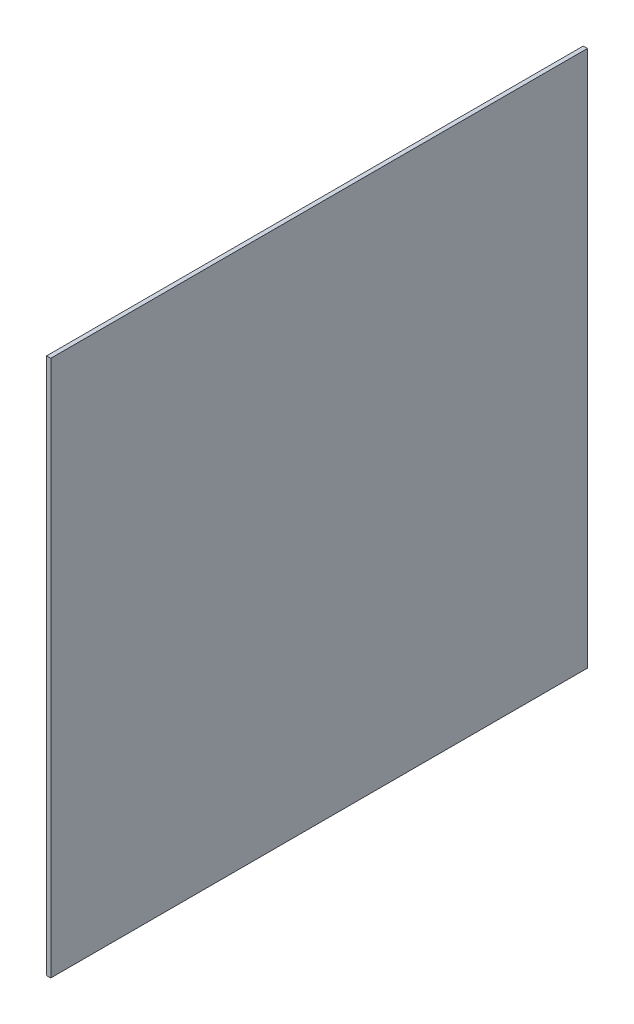
ISO-10303-21;
HEADER;
FILE_DESCRIPTION(('STEP AP214'),'2;1');
FILE_NAME('part.step','',(''),(''),'','','');
FILE_SCHEMA(('AUTOMOTIVE_DESIGN { 1 0 10303 214 1 1 1 1 }'));
ENDSEC;
DATA;
#1=APPLICATION_CONTEXT('core data for automotive mechanical design processes');
#2=APPLICATION_PROTOCOL_DEFINITION('international standard','automotive_design',2000,#1);
#3=PRODUCT_CONTEXT('',#1,'mechanical');
#4=PRODUCT('Part','Part','',(#3));
#5=PRODUCT_RELATED_PRODUCT_CATEGORY('part','',(#4));
#6=PRODUCT_DEFINITION_FORMATION('','',#4);
#7=PRODUCT_DEFINITION_CONTEXT('part definition',#1,'design');
#8=PRODUCT_DEFINITION('design','',#6,#7);
#9=PRODUCT_DEFINITION_SHAPE('','',#8);
#10=(LENGTH_UNIT() NAMED_UNIT(*) SI_UNIT(.MILLI.,.METRE.));
#11=(NAMED_UNIT(*) PLANE_ANGLE_UNIT() SI_UNIT($,.RADIAN.));
#12=(NAMED_UNIT(*) SI_UNIT($,.STERADIAN.) SOLID_ANGLE_UNIT());
#13=UNCERTAINTY_MEASURE_WITH_UNIT(LENGTH_MEASURE(1.E-05),#10,'distance_accuracy_value','');
#14=(GEOMETRIC_REPRESENTATION_CONTEXT(3) GLOBAL_UNCERTAINTY_ASSIGNED_CONTEXT((#13)) GLOBAL_UNIT_ASSIGNED_CONTEXT((#10,
#11,#12)) REPRESENTATION_CONTEXT('',''));
#15=CARTESIAN_POINT('',(0.,0.,0.));
#16=DIRECTION('',(0.,0.,1.));
#17=DIRECTION('',(1.,0.,0.));
#18=AXIS2_PLACEMENT_3D('',#15,#16,#17);
#19=CARTESIAN_POINT('',(331.999992370655,166.999999999983,156.903999999956));
#20=DIRECTION('',(1.,0.,0.));
#21=DIRECTION('',(0.,1.,0.));
#22=AXIS2_PLACEMENT_3D('',#19,#20,#21);
#23=PLANE('',#22);
#24=DIRECTION('',(0.,-1.,2.55099249257735E-13));
#25=VECTOR('',#24,1.);
#26=CARTESIAN_POINT('',(331.999992370655,351.999999999989,-45.0960000000917));
#27=LINE('',#26,#25);
#28=CARTESIAN_POINT('',(331.999992370655,358.99999999997,-45.0960000000935));
#29=VERTEX_POINT('',#28);
#30=CARTESIAN_POINT('',(331.999992370655,-25.0000000001071,-45.0959999999957));
#31=VERTEX_POINT('',#30);
#32=EDGE_CURVE('E27',#29,#31,#27,.T.);
#33=ORIENTED_EDGE('',*,*,#32,.T.);
#34=DIRECTION('',(0.,2.54947484509169E-13,1.));
#35=VECTOR('',#34,1.);
#36=CARTESIAN_POINT('',(331.999992370655,-25.0000000001073,-45.973354245283));
#37=LINE('',#36,#35);
#38=CARTESIAN_POINT('',(331.999992370655,-25.0000000000092,338.903992370612));
#39=VERTEX_POINT('',#38);
#40=EDGE_CURVE('E20',#31,#39,#37,.T.);
#41=ORIENTED_EDGE('',*,*,#40,.T.);
#42=DIRECTION('',(0.,1.,-2.60532405807183E-13));
#43=VECTOR('',#42,1.);
#44=CARTESIAN_POINT('',(331.999992370655,263.000000000049,338.903992370537));
#45=LINE('',#44,#43);
#46=CARTESIAN_POINT('',(331.999992370655,359.000000000068,338.903992370512));
#47=VERTEX_POINT('',#46);
#48=EDGE_CURVE('E85',#39,#47,#45,.T.);
#49=ORIENTED_EDGE('',*,*,#48,.T.);
#50=DIRECTION('',(0.,2.55319606700704E-13,1.));
#51=VECTOR('',#50,1.);
#52=CARTESIAN_POINT('',(331.999992370655,358.99999999997,-45.9733542453797));
#53=LINE('',#52,#51);
#54=EDGE_CURVE('E72',#29,#47,#53,.T.);
#55=ORIENTED_EDGE('',*,*,#54,.F.);
#56=EDGE_LOOP('',(#33,#41,#49,#55));
#57=FACE_BOUND('',#56,.T.);
#58=ADVANCED_FACE('F17',(#57),#23,.F.);
#59=CARTESIAN_POINT('',(334.999992370655,166.999999999983,156.903999999956));
#60=DIRECTION('',(1.,0.,0.));
#61=DIRECTION('',(0.,1.,0.));
#62=AXIS2_PLACEMENT_3D('',#59,#60,#61);
#63=PLANE('',#62);
#64=DIRECTION('',(0.,1.,-2.55099249257735E-13));
#65=VECTOR('',#64,1.);
#66=CARTESIAN_POINT('',(334.999992370655,351.999999999989,-45.0960000000917));
#67=LINE('',#66,#65);
#68=CARTESIAN_POINT('',(334.999992370655,-25.0000000001071,-45.0959999999957));
#69=VERTEX_POINT('',#68);
#70=CARTESIAN_POINT('',(334.999992370655,358.99999999997,-45.0960000000935));
#71=VERTEX_POINT('',#70);
#72=EDGE_CURVE('E11',#69,#71,#67,.T.);
#73=ORIENTED_EDGE('',*,*,#72,.T.);
#74=DIRECTION('',(0.,2.55319606700704E-13,1.));
#75=VECTOR('',#74,1.);
#76=CARTESIAN_POINT('',(334.999992370655,358.99999999997,-45.9733542453797));
#77=LINE('',#76,#75);
#78=CARTESIAN_POINT('',(334.999992370655,359.000000000068,338.903992370512));
#79=VERTEX_POINT('',#78);
#80=EDGE_CURVE('E81',#71,#79,#77,.T.);
#81=ORIENTED_EDGE('',*,*,#80,.T.);
#82=DIRECTION('',(0.,-1.,2.60532405807183E-13));
#83=VECTOR('',#82,1.);
#84=CARTESIAN_POINT('',(334.999992370655,263.000000000049,338.903992370537));
#85=LINE('',#84,#83);
#86=CARTESIAN_POINT('',(334.999992370655,-25.0000000000092,338.903992370612));
#87=VERTEX_POINT('',#86);
#88=EDGE_CURVE('E63',#79,#87,#85,.T.);
#89=ORIENTED_EDGE('',*,*,#88,.T.);
#90=DIRECTION('',(0.,-2.54947484509169E-13,-1.));
#91=VECTOR('',#90,1.);
#92=CARTESIAN_POINT('',(334.999992370655,-25.0000000001073,-45.973354245283));
#93=LINE('',#92,#91);
#94=EDGE_CURVE('E100',#87,#69,#93,.T.);
#95=ORIENTED_EDGE('',*,*,#94,.T.);
#96=EDGE_LOOP('',(#73,#81,#89,#95));
#97=FACE_BOUND('',#96,.T.);
#98=ADVANCED_FACE('F148',(#97),#63,.T.);
#99=CARTESIAN_POINT('',(331.999992370655,-25.0000000001071,-45.0959999999955));
#100=DIRECTION('',(0.,-2.55099249257735E-13,-1.));
#101=DIRECTION('',(0.,-1.,2.55099249257735E-13));
#102=AXIS2_PLACEMENT_3D('',#99,#100,#101);
#103=PLANE('',#102);
#104=ORIENTED_EDGE('',*,*,#32,.F.);
#105=DIRECTION('',(1.,0.,0.));
#106=VECTOR('',#105,1.);
#107=CARTESIAN_POINT('',(331.999992370655,358.99999999997,-45.0960000000935));
#108=LINE('',#107,#106);
#109=EDGE_CURVE('E77',#29,#71,#108,.T.);
#110=ORIENTED_EDGE('',*,*,#109,.T.);
#111=ORIENTED_EDGE('',*,*,#72,.F.);
#112=DIRECTION('',(1.,0.,0.));
#113=VECTOR('',#112,1.);
#114=CARTESIAN_POINT('',(331.999992370655,-25.0000000001071,-45.0959999999957));
#115=LINE('',#114,#113);
#116=EDGE_CURVE('E115',#31,#69,#115,.T.);
#117=ORIENTED_EDGE('',*,*,#116,.F.);
#118=EDGE_LOOP('',(#104,#110,#111,#117));
#119=FACE_BOUND('',#118,.T.);
#120=ADVANCED_FACE('F143',(#119),#103,.T.);
#121=CARTESIAN_POINT('',(331.999992370655,358.99999999997,-45.0960000000935));
#122=DIRECTION('',(0.,1.,-2.55319606700704E-13));
#123=DIRECTION('',(0.,-2.55319606700704E-13,-1.));
#124=AXIS2_PLACEMENT_3D('',#121,#122,#123);
#125=PLANE('',#124);
#126=ORIENTED_EDGE('',*,*,#54,.T.);
#127=DIRECTION('',(1.,0.,0.));
#128=VECTOR('',#127,1.);
#129=CARTESIAN_POINT('',(331.999992370655,359.000000000068,338.903992370512));
#130=LINE('',#129,#128);
#131=EDGE_CURVE('E76',#47,#79,#130,.T.);
#132=ORIENTED_EDGE('',*,*,#131,.T.);
#133=ORIENTED_EDGE('',*,*,#80,.F.);
#134=ORIENTED_EDGE('',*,*,#109,.F.);
#135=EDGE_LOOP('',(#126,#132,#133,#134));
#136=FACE_BOUND('',#135,.T.);
#137=ADVANCED_FACE('F74',(#136),#125,.T.);
#138=CARTESIAN_POINT('',(331.999992370655,359.000000000068,338.903992370512));
#139=DIRECTION('',(0.,2.60532405807183E-13,1.));
#140=DIRECTION('',(0.,-1.,2.60532405807183E-13));
#141=AXIS2_PLACEMENT_3D('',#138,#139,#140);
#142=PLANE('',#141);
#143=ORIENTED_EDGE('',*,*,#48,.F.);
#144=DIRECTION('',(1.,0.,0.));
#145=VECTOR('',#144,1.);
#146=CARTESIAN_POINT('',(331.999992370655,-25.0000000000092,338.903992370612));
#147=LINE('',#146,#145);
#148=EDGE_CURVE('E92',#39,#87,#147,.T.);
#149=ORIENTED_EDGE('',*,*,#148,.T.);
#150=ORIENTED_EDGE('',*,*,#88,.F.);
#151=ORIENTED_EDGE('',*,*,#131,.F.);
#152=EDGE_LOOP('',(#143,#149,#150,#151));
#153=FACE_BOUND('',#152,.T.);
#154=ADVANCED_FACE('F84',(#153),#142,.T.);
#155=CARTESIAN_POINT('',(331.999992370655,-25.0000000000041,358.904000000005));
#156=DIRECTION('',(0.,-1.,2.54947484509169E-13));
#157=DIRECTION('',(-1.,0.,0.));
#158=AXIS2_PLACEMENT_3D('',#155,#156,#157);
#159=PLANE('',#158);
#160=ORIENTED_EDGE('',*,*,#40,.F.);
#161=ORIENTED_EDGE('',*,*,#116,.T.);
#162=ORIENTED_EDGE('',*,*,#94,.F.);
#163=ORIENTED_EDGE('',*,*,#148,.F.);
#164=EDGE_LOOP('',(#160,#161,#162,#163));
#165=FACE_BOUND('',#164,.T.);
#166=ADVANCED_FACE('F137',(#165),#159,.T.);
#167=CLOSED_SHELL('',(#58,#98,#120,#137,#154,#166));
#168=MANIFOLD_SOLID_BREP('B1',#167);
#169=ADVANCED_BREP_SHAPE_REPRESENTATION('',(#18,#168),#14);
#170=SHAPE_DEFINITION_REPRESENTATION(#9,#169);
ENDSEC;
END-ISO-10303-21;
